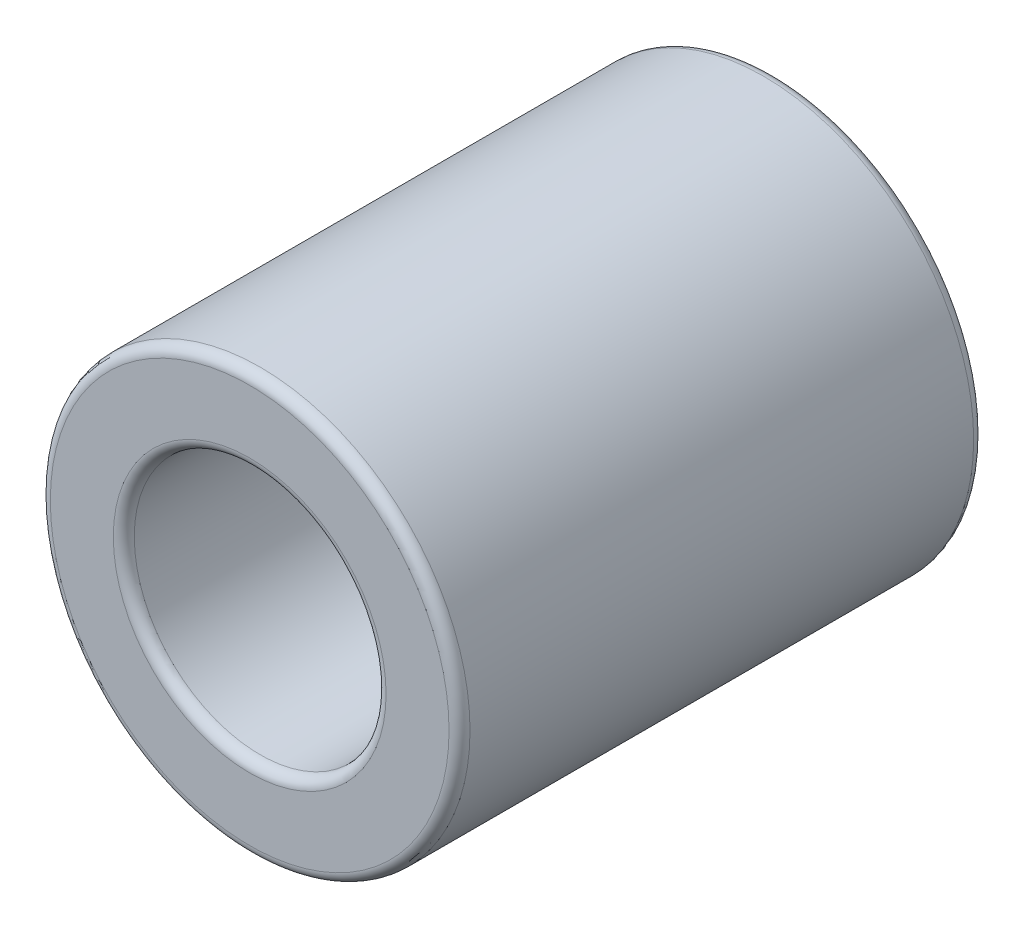
ISO-10303-21;
HEADER;
FILE_DESCRIPTION(('STEP AP214'),'2;1');
FILE_NAME('part.step','',(''),(''),'','','');
FILE_SCHEMA(('AUTOMOTIVE_DESIGN { 1 0 10303 214 1 1 1 1 }'));
ENDSEC;
DATA;
#1=APPLICATION_CONTEXT('core data for automotive mechanical design processes');
#2=APPLICATION_PROTOCOL_DEFINITION('international standard','automotive_design',2000,#1);
#3=PRODUCT_CONTEXT('',#1,'mechanical');
#4=PRODUCT('Part','Part','',(#3));
#5=PRODUCT_RELATED_PRODUCT_CATEGORY('part','',(#4));
#6=PRODUCT_DEFINITION_FORMATION('','',#4);
#7=PRODUCT_DEFINITION_CONTEXT('part definition',#1,'design');
#8=PRODUCT_DEFINITION('design','',#6,#7);
#9=PRODUCT_DEFINITION_SHAPE('','',#8);
#10=(LENGTH_UNIT() NAMED_UNIT(*) SI_UNIT(.MILLI.,.METRE.));
#11=(NAMED_UNIT(*) PLANE_ANGLE_UNIT() SI_UNIT($,.RADIAN.));
#12=(NAMED_UNIT(*) SI_UNIT($,.STERADIAN.) SOLID_ANGLE_UNIT());
#13=UNCERTAINTY_MEASURE_WITH_UNIT(LENGTH_MEASURE(1.E-05),#10,'distance_accuracy_value','');
#14=(GEOMETRIC_REPRESENTATION_CONTEXT(3) GLOBAL_UNCERTAINTY_ASSIGNED_CONTEXT((#13)) GLOBAL_UNIT_ASSIGNED_CONTEXT((#10,
#11,#12)) REPRESENTATION_CONTEXT('',''));
#15=CARTESIAN_POINT('',(0.,0.,0.));
#16=DIRECTION('',(0.,0.,1.));
#17=DIRECTION('',(1.,0.,0.));
#18=AXIS2_PLACEMENT_3D('',#15,#16,#17);
#19=CARTESIAN_POINT('',(0.,0.,25.));
#20=DIRECTION('',(0.,0.,-1.));
#21=DIRECTION('',(-1.,0.,0.));
#22=AXIS2_PLACEMENT_3D('',#19,#20,#21);
#23=CYLINDRICAL_SURFACE('',#22,10.);
#24=CARTESIAN_POINT('',(0.,0.,0.5));
#25=DIRECTION('',(0.,0.,1.));
#26=DIRECTION('',(1.,0.,0.));
#27=AXIS2_PLACEMENT_3D('',#24,#25,#26);
#28=CIRCLE('',#27,10.);
#29=CARTESIAN_POINT('',(10.,0.,0.5));
#30=VERTEX_POINT('',#29);
#31=EDGE_CURVE('E10',#30,#30,#28,.T.);
#32=ORIENTED_EDGE('',*,*,#31,.T.);
#33=EDGE_LOOP('',(#32));
#34=FACE_BOUND('',#33,.T.);
#35=CARTESIAN_POINT('',(0.,0.,24.5));
#36=DIRECTION('',(0.,0.,1.));
#37=DIRECTION('',(1.,0.,0.));
#38=AXIS2_PLACEMENT_3D('',#35,#36,#37);
#39=CIRCLE('',#38,10.);
#40=CARTESIAN_POINT('',(10.,0.,24.5));
#41=VERTEX_POINT('',#40);
#42=EDGE_CURVE('E51',#41,#41,#39,.F.);
#43=ORIENTED_EDGE('',*,*,#42,.T.);
#44=EDGE_LOOP('',(#43));
#45=FACE_BOUND('',#44,.T.);
#46=ADVANCED_FACE('F43',(#34,#45),#23,.T.);
#47=CARTESIAN_POINT('',(0.,0.,25.));
#48=DIRECTION('',(0.,0.,1.));
#49=DIRECTION('',(1.,0.,0.));
#50=AXIS2_PLACEMENT_3D('',#47,#48,#49);
#51=PLANE('',#50);
#52=CARTESIAN_POINT('',(0.,0.,25.));
#53=DIRECTION('',(0.,0.,1.));
#54=DIRECTION('',(1.,0.,0.));
#55=AXIS2_PLACEMENT_3D('',#52,#53,#54);
#56=CIRCLE('',#55,6.5);
#57=CARTESIAN_POINT('',(6.5,0.,25.));
#58=VERTEX_POINT('',#57);
#59=EDGE_CURVE('E56',#58,#58,#56,.F.);
#60=ORIENTED_EDGE('',*,*,#59,.T.);
#61=EDGE_LOOP('',(#60));
#62=FACE_BOUND('',#61,.T.);
#63=CARTESIAN_POINT('',(0.,0.,25.));
#64=DIRECTION('',(0.,0.,1.));
#65=DIRECTION('',(1.,0.,0.));
#66=AXIS2_PLACEMENT_3D('',#63,#64,#65);
#67=CIRCLE('',#66,9.5);
#68=CARTESIAN_POINT('',(9.5,0.,25.));
#69=VERTEX_POINT('',#68);
#70=EDGE_CURVE('E61',#69,#69,#67,.T.);
#71=ORIENTED_EDGE('',*,*,#70,.T.);
#72=EDGE_LOOP('',(#71));
#73=FACE_BOUND('',#72,.T.);
#74=ADVANCED_FACE('F106',(#62,#73),#51,.T.);
#75=CARTESIAN_POINT('',(0.,0.,0.));
#76=DIRECTION('',(0.,0.,1.));
#77=DIRECTION('',(1.,0.,0.));
#78=AXIS2_PLACEMENT_3D('',#75,#76,#77);
#79=PLANE('',#78);
#80=CARTESIAN_POINT('',(0.,0.,0.));
#81=DIRECTION('',(0.,0.,1.));
#82=DIRECTION('',(1.,0.,0.));
#83=AXIS2_PLACEMENT_3D('',#80,#81,#82);
#84=CIRCLE('',#83,3.5);
#85=CARTESIAN_POINT('',(3.5,0.,0.));
#86=VERTEX_POINT('',#85);
#87=EDGE_CURVE('E71',#86,#86,#84,.T.);
#88=ORIENTED_EDGE('',*,*,#87,.T.);
#89=EDGE_LOOP('',(#88));
#90=FACE_BOUND('',#89,.T.);
#91=CARTESIAN_POINT('',(0.,0.,0.));
#92=DIRECTION('',(0.,0.,1.));
#93=DIRECTION('',(1.,0.,0.));
#94=AXIS2_PLACEMENT_3D('',#91,#92,#93);
#95=CIRCLE('',#94,9.5);
#96=CARTESIAN_POINT('',(9.5,0.,0.));
#97=VERTEX_POINT('',#96);
#98=EDGE_CURVE('E75',#97,#97,#95,.F.);
#99=ORIENTED_EDGE('',*,*,#98,.T.);
#100=EDGE_LOOP('',(#99));
#101=FACE_BOUND('',#100,.T.);
#102=ADVANCED_FACE('F96',(#90,#101),#79,.F.);
#103=CARTESIAN_POINT('',(0.,0.,12.5));
#104=DIRECTION('',(0.,0.,1.));
#105=DIRECTION('',(1.,0.,0.));
#106=AXIS2_PLACEMENT_3D('',#103,#104,#105);
#107=CYLINDRICAL_SURFACE('',#106,6.);
#108=CARTESIAN_POINT('',(0.,0.,24.5));
#109=DIRECTION('',(0.,0.,1.));
#110=DIRECTION('',(1.,0.,0.));
#111=AXIS2_PLACEMENT_3D('',#108,#109,#110);
#112=CIRCLE('',#111,6.);
#113=CARTESIAN_POINT('',(6.,0.,24.5));
#114=VERTEX_POINT('',#113);
#115=EDGE_CURVE('E67',#114,#114,#112,.T.);
#116=ORIENTED_EDGE('',*,*,#115,.T.);
#117=EDGE_LOOP('',(#116));
#118=FACE_BOUND('',#117,.T.);
#119=CARTESIAN_POINT('',(0.,0.,12.5));
#120=DIRECTION('',(0.,0.,1.));
#121=DIRECTION('',(1.,0.,0.));
#122=AXIS2_PLACEMENT_3D('',#119,#120,#121);
#123=CIRCLE('',#122,6.);
#124=CARTESIAN_POINT('',(6.,0.,12.5));
#125=VERTEX_POINT('',#124);
#126=EDGE_CURVE('E83',#125,#125,#123,.T.);
#127=ORIENTED_EDGE('',*,*,#126,.F.);
#128=EDGE_LOOP('',(#127));
#129=FACE_BOUND('',#128,.T.);
#130=ADVANCED_FACE('F94',(#118,#129),#107,.F.);
#131=CARTESIAN_POINT('',(0.,0.,12.5));
#132=DIRECTION('',(0.,0.,1.));
#133=DIRECTION('',(1.,0.,0.));
#134=AXIS2_PLACEMENT_3D('',#131,#132,#133);
#135=PLANE('',#134);
#136=CARTESIAN_POINT('',(0.,0.,12.5));
#137=DIRECTION('',(0.,0.,1.));
#138=DIRECTION('',(1.,0.,0.));
#139=AXIS2_PLACEMENT_3D('',#136,#137,#138);
#140=CIRCLE('',#139,3.);
#141=CARTESIAN_POINT('',(3.,0.,12.5));
#142=VERTEX_POINT('',#141);
#143=EDGE_CURVE('E84',#142,#142,#140,.T.);
#144=ORIENTED_EDGE('',*,*,#143,.F.);
#145=EDGE_LOOP('',(#144));
#146=FACE_BOUND('',#145,.T.);
#147=ORIENTED_EDGE('',*,*,#126,.T.);
#148=EDGE_LOOP('',(#147));
#149=FACE_BOUND('',#148,.T.);
#150=ADVANCED_FACE('F92',(#146,#149),#135,.T.);
#151=CARTESIAN_POINT('',(0.,0.,15.));
#152=DIRECTION('',(0.,0.,-1.));
#153=DIRECTION('',(-1.,0.,0.));
#154=AXIS2_PLACEMENT_3D('',#151,#152,#153);
#155=CYLINDRICAL_SURFACE('',#154,3.);
#156=CARTESIAN_POINT('',(0.,0.,0.5));
#157=DIRECTION('',(0.,0.,1.));
#158=DIRECTION('',(1.,0.,0.));
#159=AXIS2_PLACEMENT_3D('',#156,#157,#158);
#160=CIRCLE('',#159,3.);
#161=CARTESIAN_POINT('',(3.,0.,0.5));
#162=VERTEX_POINT('',#161);
#163=EDGE_CURVE('E79',#162,#162,#160,.F.);
#164=ORIENTED_EDGE('',*,*,#163,.T.);
#165=EDGE_LOOP('',(#164));
#166=FACE_BOUND('',#165,.T.);
#167=ORIENTED_EDGE('',*,*,#143,.T.);
#168=EDGE_LOOP('',(#167));
#169=FACE_BOUND('',#168,.T.);
#170=ADVANCED_FACE('F103',(#166,#169),#155,.F.);
#171=CARTESIAN_POINT('',(0.,0.,0.5));
#172=DIRECTION('',(0.,0.,1.));
#173=DIRECTION('',(1.,0.,0.));
#174=AXIS2_PLACEMENT_3D('',#171,#172,#173);
#175=TOROIDAL_SURFACE('',#174,3.5,0.5);
#176=ORIENTED_EDGE('',*,*,#87,.F.);
#177=EDGE_LOOP('',(#176));
#178=FACE_BOUND('',#177,.T.);
#179=ORIENTED_EDGE('',*,*,#163,.F.);
#180=EDGE_LOOP('',(#179));
#181=FACE_BOUND('',#180,.T.);
#182=ADVANCED_FACE('F117',(#178,#181),#175,.T.);
#183=CARTESIAN_POINT('',(0.,0.,24.5));
#184=DIRECTION('',(0.,0.,1.));
#185=DIRECTION('',(1.,0.,0.));
#186=AXIS2_PLACEMENT_3D('',#183,#184,#185);
#187=TOROIDAL_SURFACE('',#186,6.5,0.5);
#188=ORIENTED_EDGE('',*,*,#59,.F.);
#189=EDGE_LOOP('',(#188));
#190=FACE_BOUND('',#189,.T.);
#191=ORIENTED_EDGE('',*,*,#115,.F.);
#192=EDGE_LOOP('',(#191));
#193=FACE_BOUND('',#192,.T.);
#194=ADVANCED_FACE('F120',(#190,#193),#187,.T.);
#195=CARTESIAN_POINT('',(0.,0.,0.5));
#196=DIRECTION('',(0.,0.,1.));
#197=DIRECTION('',(1.,0.,0.));
#198=AXIS2_PLACEMENT_3D('',#195,#196,#197);
#199=TOROIDAL_SURFACE('',#198,9.5,0.5);
#200=ORIENTED_EDGE('',*,*,#98,.F.);
#201=EDGE_LOOP('',(#200));
#202=FACE_BOUND('',#201,.T.);
#203=ORIENTED_EDGE('',*,*,#31,.F.);
#204=EDGE_LOOP('',(#203));
#205=FACE_BOUND('',#204,.T.);
#206=ADVANCED_FACE('F123',(#202,#205),#199,.T.);
#207=CARTESIAN_POINT('',(0.,0.,24.5));
#208=DIRECTION('',(0.,0.,1.));
#209=DIRECTION('',(1.,0.,0.));
#210=AXIS2_PLACEMENT_3D('',#207,#208,#209);
#211=TOROIDAL_SURFACE('',#210,9.5,0.5);
#212=ORIENTED_EDGE('',*,*,#42,.F.);
#213=EDGE_LOOP('',(#212));
#214=FACE_BOUND('',#213,.T.);
#215=ORIENTED_EDGE('',*,*,#70,.F.);
#216=EDGE_LOOP('',(#215));
#217=FACE_BOUND('',#216,.T.);
#218=ADVANCED_FACE('F45',(#214,#217),#211,.T.);
#219=CLOSED_SHELL('',(#46,#74,#102,#130,#150,#170,#182,#194,#206,#218));
#220=MANIFOLD_SOLID_BREP('B2',#219);
#221=ADVANCED_BREP_SHAPE_REPRESENTATION('',(#18,#220),#14);
#222=SHAPE_DEFINITION_REPRESENTATION(#9,#221);
ENDSEC;
END-ISO-10303-21;
